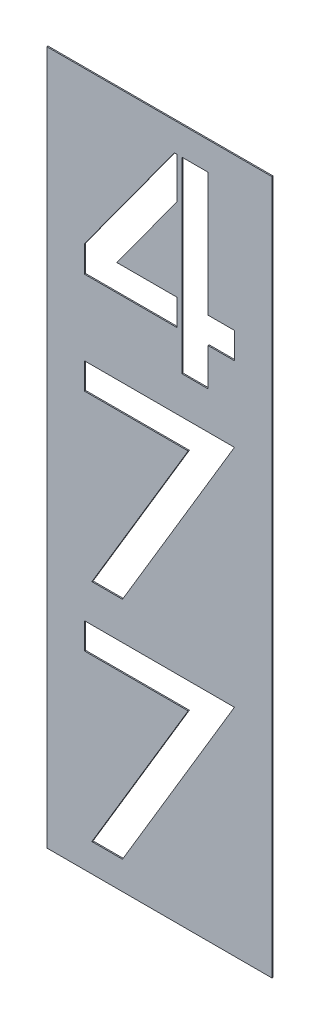
ISO-10303-21;
HEADER;
FILE_DESCRIPTION(('STEP AP214'),'2;1');
FILE_NAME('part.step','',(''),(''),'','','');
FILE_SCHEMA(('AUTOMOTIVE_DESIGN { 1 0 10303 214 1 1 1 1 }'));
ENDSEC;
DATA;
#1=APPLICATION_CONTEXT('core data for automotive mechanical design processes');
#2=APPLICATION_PROTOCOL_DEFINITION('international standard','automotive_design',2000,#1);
#3=PRODUCT_CONTEXT('',#1,'mechanical');
#4=PRODUCT('Part','Part','',(#3));
#5=PRODUCT_RELATED_PRODUCT_CATEGORY('part','',(#4));
#6=PRODUCT_DEFINITION_FORMATION('','',#4);
#7=PRODUCT_DEFINITION_CONTEXT('part definition',#1,'design');
#8=PRODUCT_DEFINITION('design','',#6,#7);
#9=PRODUCT_DEFINITION_SHAPE('','',#8);
#10=(LENGTH_UNIT() NAMED_UNIT(*) SI_UNIT(.MILLI.,.METRE.));
#11=(NAMED_UNIT(*) PLANE_ANGLE_UNIT() SI_UNIT($,.RADIAN.));
#12=(NAMED_UNIT(*) SI_UNIT($,.STERADIAN.) SOLID_ANGLE_UNIT());
#13=UNCERTAINTY_MEASURE_WITH_UNIT(LENGTH_MEASURE(1.E-05),#10,'distance_accuracy_value','');
#14=(GEOMETRIC_REPRESENTATION_CONTEXT(3) GLOBAL_UNCERTAINTY_ASSIGNED_CONTEXT((#13)) GLOBAL_UNIT_ASSIGNED_CONTEXT((#10,
#11,#12)) REPRESENTATION_CONTEXT('',''));
#15=CARTESIAN_POINT('',(0.,0.,0.));
#16=DIRECTION('',(0.,0.,1.));
#17=DIRECTION('',(1.,0.,0.));
#18=AXIS2_PLACEMENT_3D('',#15,#16,#17);
#19=CARTESIAN_POINT('',(6.03249999999999,25.4,-50.8247986346232));
#20=DIRECTION('',(-1.,0.,0.));
#21=DIRECTION('',(0.,0.,1.));
#22=AXIS2_PLACEMENT_3D('',#19,#20,#21);
#23=PLANE('',#22);
#24=DIRECTION('',(0.,-1.,0.));
#25=VECTOR('',#24,1.);
#26=CARTESIAN_POINT('',(6.03249999999999,25.4,0.4));
#27=LINE('',#26,#25);
#28=CARTESIAN_POINT('',(6.03249999999999,34.29,0.4));
#29=VERTEX_POINT('',#28);
#30=CARTESIAN_POINT('',(6.03249999999999,25.4,0.4));
#31=VERTEX_POINT('',#30);
#32=EDGE_CURVE('E90',#29,#31,#27,.T.);
#33=ORIENTED_EDGE('',*,*,#32,.F.);
#34=DIRECTION('',(0.,0.,-1.));
#35=VECTOR('',#34,1.);
#36=CARTESIAN_POINT('',(6.03249999999999,34.29,-50.8247986346232));
#37=LINE('',#36,#35);
#38=CARTESIAN_POINT('',(6.03249999999999,34.29,0.));
#39=VERTEX_POINT('',#38);
#40=EDGE_CURVE('E12',#29,#39,#37,.T.);
#41=ORIENTED_EDGE('',*,*,#40,.T.);
#42=DIRECTION('',(0.,1.,0.));
#43=VECTOR('',#42,1.);
#44=CARTESIAN_POINT('',(6.03249999999999,25.4,0.));
#45=LINE('',#44,#43);
#46=CARTESIAN_POINT('',(6.03249999999999,25.4,0.));
#47=VERTEX_POINT('',#46);
#48=EDGE_CURVE('E305',#47,#39,#45,.T.);
#49=ORIENTED_EDGE('',*,*,#48,.F.);
#50=DIRECTION('',(0.,0.,1.));
#51=VECTOR('',#50,1.);
#52=CARTESIAN_POINT('',(6.03249999999999,25.4,-50.8247986346232));
#53=LINE('',#52,#51);
#54=EDGE_CURVE('E314',#47,#31,#53,.T.);
#55=ORIENTED_EDGE('',*,*,#54,.T.);
#56=EDGE_LOOP('',(#33,#41,#49,#55));
#57=FACE_BOUND('',#56,.T.);
#58=ADVANCED_FACE('F66',(#57),#23,.T.);
#59=CARTESIAN_POINT('',(6.03249999999999,62.3950533971677,0.));
#60=VERTEX_POINT('',#59);
#61=CARTESIAN_POINT('',(6.03249999999999,76.2,0.));
#62=VERTEX_POINT('',#61);
#63=EDGE_CURVE('E310',#60,#62,#45,.T.);
#64=ORIENTED_EDGE('',*,*,#63,.F.);
#65=DIRECTION('',(0.,0.,1.));
#66=VECTOR('',#65,1.);
#67=CARTESIAN_POINT('',(6.03249999999999,62.3950533971678,-50.8247986346232));
#68=LINE('',#67,#66);
#69=CARTESIAN_POINT('',(6.03249999999999,62.3950533971677,0.399999999999999));
#70=VERTEX_POINT('',#69);
#71=EDGE_CURVE('E75',#60,#70,#68,.T.);
#72=ORIENTED_EDGE('',*,*,#71,.T.);
#73=CARTESIAN_POINT('',(6.03249999999999,76.2,0.4));
#74=VERTEX_POINT('',#73);
#75=EDGE_CURVE('E283',#74,#70,#27,.T.);
#76=ORIENTED_EDGE('',*,*,#75,.F.);
#77=DIRECTION('',(0.,0.,1.));
#78=VECTOR('',#77,1.);
#79=CARTESIAN_POINT('',(6.03249999999999,76.2,-50.8247986346232));
#80=LINE('',#79,#78);
#81=EDGE_CURVE('E318',#62,#74,#80,.T.);
#82=ORIENTED_EDGE('',*,*,#81,.F.);
#83=EDGE_LOOP('',(#64,#72,#76,#82));
#84=FACE_BOUND('',#83,.T.);
#85=ADVANCED_FACE('F601',(#84),#23,.T.);
#86=CARTESIAN_POINT('',(0.,76.2,0.4));
#87=DIRECTION('',(0.,1.,0.));
#88=DIRECTION('',(0.,0.,1.));
#89=AXIS2_PLACEMENT_3D('',#86,#87,#88);
#90=PLANE('',#89);
#91=DIRECTION('',(1.,0.,0.));
#92=VECTOR('',#91,1.);
#93=CARTESIAN_POINT('',(0.,76.2,0.4));
#94=LINE('',#93,#92);
#95=CARTESIAN_POINT('',(7.61999999999999,76.2,0.4));
#96=VERTEX_POINT('',#95);
#97=CARTESIAN_POINT('',(16.51,76.2,0.4));
#98=VERTEX_POINT('',#97);
#99=EDGE_CURVE('E361',#96,#98,#94,.T.);
#100=ORIENTED_EDGE('',*,*,#99,.F.);
#101=DIRECTION('',(0.,0.,1.));
#102=VECTOR('',#101,1.);
#103=CARTESIAN_POINT('',(7.61999999999999,76.2,-50.8247986346232));
#104=LINE('',#103,#102);
#105=CARTESIAN_POINT('',(7.61999999999999,76.2,0.));
#106=VERTEX_POINT('',#105);
#107=EDGE_CURVE('E313',#106,#96,#104,.T.);
#108=ORIENTED_EDGE('',*,*,#107,.F.);
#109=DIRECTION('',(1.,0.,0.));
#110=VECTOR('',#109,1.);
#111=CARTESIAN_POINT('',(0.,76.2,0.));
#112=LINE('',#111,#110);
#113=CARTESIAN_POINT('',(16.51,76.2,0.));
#114=VERTEX_POINT('',#113);
#115=EDGE_CURVE('E449',#106,#114,#112,.T.);
#116=ORIENTED_EDGE('',*,*,#115,.T.);
#117=DIRECTION('',(0.,0.,-1.));
#118=VECTOR('',#117,1.);
#119=CARTESIAN_POINT('',(16.51,76.2,0.4));
#120=LINE('',#119,#118);
#121=EDGE_CURVE('E557',#98,#114,#120,.T.);
#122=ORIENTED_EDGE('',*,*,#121,.F.);
#123=EDGE_LOOP('',(#100,#108,#116,#122));
#124=FACE_BOUND('',#123,.T.);
#125=ADVANCED_FACE('F613',(#124),#90,.F.);
#126=CARTESIAN_POINT('',(0.,-85.09,0.4));
#127=DIRECTION('',(0.,-1.,0.));
#128=DIRECTION('',(0.,0.,-1.));
#129=AXIS2_PLACEMENT_3D('',#126,#127,#128);
#130=PLANE('',#129);
#131=DIRECTION('',(-1.,0.,0.));
#132=VECTOR('',#131,1.);
#133=CARTESIAN_POINT('',(0.,-85.09,0.));
#134=LINE('',#133,#132);
#135=CARTESIAN_POINT('',(9.73957327900089,-85.09,0.));
#136=VERTEX_POINT('',#135);
#137=CARTESIAN_POINT('',(-25.4,-85.09,0.));
#138=VERTEX_POINT('',#137);
#139=EDGE_CURVE('E481',#136,#138,#134,.T.);
#140=ORIENTED_EDGE('',*,*,#139,.T.);
#141=DIRECTION('',(0.,0.,-1.));
#142=VECTOR('',#141,1.);
#143=CARTESIAN_POINT('',(-25.4,-85.09,0.4));
#144=LINE('',#143,#142);
#145=CARTESIAN_POINT('',(-25.4,-85.09,0.4));
#146=VERTEX_POINT('',#145);
#147=EDGE_CURVE('E520',#146,#138,#144,.T.);
#148=ORIENTED_EDGE('',*,*,#147,.F.);
#149=DIRECTION('',(-1.,0.,0.));
#150=VECTOR('',#149,1.);
#151=CARTESIAN_POINT('',(0.,-85.09,0.4));
#152=LINE('',#151,#150);
#153=CARTESIAN_POINT('',(9.73957327900089,-85.09,0.4));
#154=VERTEX_POINT('',#153);
#155=EDGE_CURVE('E392',#154,#146,#152,.T.);
#156=ORIENTED_EDGE('',*,*,#155,.F.);
#157=DIRECTION('',(0.,0.,-1.));
#158=VECTOR('',#157,1.);
#159=CARTESIAN_POINT('',(9.73957327900089,-85.09,0.4));
#160=LINE('',#159,#158);
#161=EDGE_CURVE('E499',#154,#136,#160,.T.);
#162=ORIENTED_EDGE('',*,*,#161,.T.);
#163=EDGE_LOOP('',(#140,#148,#156,#162));
#164=FACE_BOUND('',#163,.T.);
#165=ADVANCED_FACE('F688',(#164),#130,.F.);
#166=CARTESIAN_POINT('',(-25.4,0.,0.4));
#167=DIRECTION('',(-1.,0.,0.));
#168=DIRECTION('',(0.,-1.,0.));
#169=AXIS2_PLACEMENT_3D('',#166,#167,#168);
#170=PLANE('',#169);
#171=DIRECTION('',(0.,1.,0.));
#172=VECTOR('',#171,1.);
#173=CARTESIAN_POINT('',(-25.4,0.,0.));
#174=LINE('',#173,#172);
#175=CARTESIAN_POINT('',(-25.4,-76.2,0.));
#176=VERTEX_POINT('',#175);
#177=EDGE_CURVE('E485',#138,#176,#174,.T.);
#178=ORIENTED_EDGE('',*,*,#177,.T.);
#179=DIRECTION('',(0.,0.,-1.));
#180=VECTOR('',#179,1.);
#181=CARTESIAN_POINT('',(-25.4,-76.2,0.4));
#182=LINE('',#181,#180);
#183=CARTESIAN_POINT('',(-25.4,-76.2,0.4));
#184=VERTEX_POINT('',#183);
#185=EDGE_CURVE('E516',#184,#176,#182,.T.);
#186=ORIENTED_EDGE('',*,*,#185,.F.);
#187=DIRECTION('',(0.,1.,0.));
#188=VECTOR('',#187,1.);
#189=CARTESIAN_POINT('',(-25.4,0.,0.4));
#190=LINE('',#189,#188);
#191=EDGE_CURVE('E396',#146,#184,#190,.T.);
#192=ORIENTED_EDGE('',*,*,#191,.F.);
#193=ORIENTED_EDGE('',*,*,#147,.T.);
#194=EDGE_LOOP('',(#178,#186,#192,#193));
#195=FACE_BOUND('',#194,.T.);
#196=ADVANCED_FACE('F690',(#195),#170,.F.);
#197=CARTESIAN_POINT('',(0.,-76.2,0.4));
#198=DIRECTION('',(0.,1.,0.));
#199=DIRECTION('',(0.,0.,1.));
#200=AXIS2_PLACEMENT_3D('',#197,#198,#199);
#201=PLANE('',#200);
#202=DIRECTION('',(1.,0.,0.));
#203=VECTOR('',#202,1.);
#204=CARTESIAN_POINT('',(0.,-76.2,0.));
#205=LINE('',#204,#203);
#206=CARTESIAN_POINT('',(25.4,-76.2,0.));
#207=VERTEX_POINT('',#206);
#208=EDGE_CURVE('E488',#176,#207,#205,.T.);
#209=ORIENTED_EDGE('',*,*,#208,.T.);
#210=DIRECTION('',(0.,0.,-1.));
#211=VECTOR('',#210,1.);
#212=CARTESIAN_POINT('',(25.4,-76.2,0.4));
#213=LINE('',#212,#211);
#214=CARTESIAN_POINT('',(25.4,-76.2,0.4));
#215=VERTEX_POINT('',#214);
#216=EDGE_CURVE('E512',#215,#207,#213,.T.);
#217=ORIENTED_EDGE('',*,*,#216,.F.);
#218=DIRECTION('',(1.,0.,0.));
#219=VECTOR('',#218,1.);
#220=CARTESIAN_POINT('',(0.,-76.2,0.4));
#221=LINE('',#220,#219);
#222=EDGE_CURVE('E399',#184,#215,#221,.T.);
#223=ORIENTED_EDGE('',*,*,#222,.F.);
#224=ORIENTED_EDGE('',*,*,#185,.T.);
#225=EDGE_LOOP('',(#209,#217,#223,#224));
#226=FACE_BOUND('',#225,.T.);
#227=ADVANCED_FACE('F695',(#226),#201,.F.);
#228=CARTESIAN_POINT('',(52.2635457410299,-31.1988516609602,0.4));
#229=DIRECTION('',(0.858645221938647,-0.512570368673348,0.));
#230=DIRECTION('',(0.512570368673348,0.858645221938647,0.));
#231=AXIS2_PLACEMENT_3D('',#228,#229,#230);
#232=PLANE('',#231);
#233=DIRECTION('',(-0.512570368673348,-0.858645221938647,0.));
#234=VECTOR('',#233,1.);
#235=CARTESIAN_POINT('',(52.2635457410299,-31.1988516609602,0.));
#236=LINE('',#235,#234);
#237=CARTESIAN_POINT('',(-12.5064805569764,-139.700000000001,0.));
#238=VERTEX_POINT('',#237);
#239=EDGE_CURVE('E491',#207,#238,#236,.T.);
#240=ORIENTED_EDGE('',*,*,#239,.T.);
#241=DIRECTION('',(0.,0.,-1.));
#242=VECTOR('',#241,1.);
#243=CARTESIAN_POINT('',(-12.5064805569764,-139.700000000001,0.4));
#244=LINE('',#243,#242);
#245=CARTESIAN_POINT('',(-12.5064805569764,-139.700000000001,0.4));
#246=VERTEX_POINT('',#245);
#247=EDGE_CURVE('E508',#246,#238,#244,.T.);
#248=ORIENTED_EDGE('',*,*,#247,.F.);
#249=DIRECTION('',(-0.512570368673348,-0.858645221938647,0.));
#250=VECTOR('',#249,1.);
#251=CARTESIAN_POINT('',(52.2635457410299,-31.1988516609602,0.4));
#252=LINE('',#251,#250);
#253=EDGE_CURVE('E402',#215,#246,#252,.T.);
#254=ORIENTED_EDGE('',*,*,#253,.F.);
#255=ORIENTED_EDGE('',*,*,#216,.T.);
#256=EDGE_LOOP('',(#240,#248,#254,#255));
#257=FACE_BOUND('',#256,.T.);
#258=ADVANCED_FACE('F701',(#257),#232,.F.);
#259=CARTESIAN_POINT('',(0.,-139.700000000001,0.4));
#260=DIRECTION('',(0.,-1.,0.));
#261=DIRECTION('',(0.,0.,-1.));
#262=AXIS2_PLACEMENT_3D('',#259,#260,#261);
#263=PLANE('',#262);
#264=DIRECTION('',(-1.,0.,0.));
#265=VECTOR('',#264,1.);
#266=CARTESIAN_POINT('',(0.,-139.700000000001,0.));
#267=LINE('',#266,#265);
#268=CARTESIAN_POINT('',(-22.8599999999988,-139.700000000001,0.));
#269=VERTEX_POINT('',#268);
#270=EDGE_CURVE('E494',#238,#269,#267,.T.);
#271=ORIENTED_EDGE('',*,*,#270,.T.);
#272=DIRECTION('',(0.,0.,-1.));
#273=VECTOR('',#272,1.);
#274=CARTESIAN_POINT('',(-22.8599999999988,-139.700000000001,0.4));
#275=LINE('',#274,#273);
#276=CARTESIAN_POINT('',(-22.8599999999988,-139.700000000001,0.4));
#277=VERTEX_POINT('',#276);
#278=EDGE_CURVE('E503',#277,#269,#275,.T.);
#279=ORIENTED_EDGE('',*,*,#278,.F.);
#280=DIRECTION('',(-1.,0.,0.));
#281=VECTOR('',#280,1.);
#282=CARTESIAN_POINT('',(0.,-139.700000000001,0.4));
#283=LINE('',#282,#281);
#284=EDGE_CURVE('E405',#246,#277,#283,.T.);
#285=ORIENTED_EDGE('',*,*,#284,.F.);
#286=ORIENTED_EDGE('',*,*,#247,.T.);
#287=EDGE_LOOP('',(#271,#279,#285,#286));
#288=FACE_BOUND('',#287,.T.);
#289=ADVANCED_FACE('F705',(#288),#263,.F.);
#290=CARTESIAN_POINT('',(-32.9238918918919,23.9446486486486,0.4));
#291=DIRECTION('',(-0.808736084303189,0.588171697675046,0.));
#292=DIRECTION('',(-0.588171697675046,-0.808736084303189,0.));
#293=AXIS2_PLACEMENT_3D('',#290,#291,#292);
#294=PLANE('',#293);
#295=DIRECTION('',(0.588171697675046,0.808736084303189,0.));
#296=VECTOR('',#295,1.);
#297=CARTESIAN_POINT('',(-32.9238918918919,23.9446486486486,0.));
#298=LINE('',#297,#296);
#299=CARTESIAN_POINT('',(-25.4,34.29,0.));
#300=VERTEX_POINT('',#299);
#301=CARTESIAN_POINT('',(5.07999999999999,76.2,0.));
#302=VERTEX_POINT('',#301);
#303=EDGE_CURVE('E445',#300,#302,#298,.T.);
#304=ORIENTED_EDGE('',*,*,#303,.T.);
#305=DIRECTION('',(0.,0.,-1.));
#306=VECTOR('',#305,1.);
#307=CARTESIAN_POINT('',(5.07999999999999,76.2,0.4));
#308=LINE('',#307,#306);
#309=CARTESIAN_POINT('',(5.07999999999999,76.2,0.4));
#310=VERTEX_POINT('',#309);
#311=EDGE_CURVE('E504',#310,#302,#308,.T.);
#312=ORIENTED_EDGE('',*,*,#311,.F.);
#313=DIRECTION('',(0.588171697675046,0.808736084303189,0.));
#314=VECTOR('',#313,1.);
#315=CARTESIAN_POINT('',(-32.9238918918919,23.9446486486486,0.4));
#316=LINE('',#315,#314);
#317=CARTESIAN_POINT('',(-25.4,34.29,0.4));
#318=VERTEX_POINT('',#317);
#319=EDGE_CURVE('E357',#318,#310,#316,.T.);
#320=ORIENTED_EDGE('',*,*,#319,.F.);
#321=DIRECTION('',(0.,0.,-1.));
#322=VECTOR('',#321,1.);
#323=CARTESIAN_POINT('',(-25.4,34.29,0.4));
#324=LINE('',#323,#322);
#325=EDGE_CURVE('E524',#318,#300,#324,.T.);
#326=ORIENTED_EDGE('',*,*,#325,.T.);
#327=EDGE_LOOP('',(#304,#312,#320,#326));
#328=FACE_BOUND('',#327,.T.);
#329=ADVANCED_FACE('F767',(#328),#294,.F.);
#330=EDGE_CURVE('E450',#302,#62,#112,.T.);
#331=ORIENTED_EDGE('',*,*,#330,.T.);
#332=ORIENTED_EDGE('',*,*,#81,.T.);
#333=EDGE_CURVE('E362',#310,#74,#94,.T.);
#334=ORIENTED_EDGE('',*,*,#333,.F.);
#335=ORIENTED_EDGE('',*,*,#311,.T.);
#336=EDGE_LOOP('',(#331,#332,#334,#335));
#337=FACE_BOUND('',#336,.T.);
#338=ADVANCED_FACE('F762',(#337),#90,.F.);
#339=CARTESIAN_POINT('',(16.51,0.,0.4));
#340=DIRECTION('',(1.,0.,0.));
#341=DIRECTION('',(0.,1.,0.));
#342=AXIS2_PLACEMENT_3D('',#339,#340,#341);
#343=PLANE('',#342);
#344=DIRECTION('',(0.,-1.,0.));
#345=VECTOR('',#344,1.);
#346=CARTESIAN_POINT('',(16.51,0.,0.));
#347=LINE('',#346,#345);
#348=CARTESIAN_POINT('',(16.51,34.29,0.));
#349=VERTEX_POINT('',#348);
#350=EDGE_CURVE('E454',#114,#349,#347,.T.);
#351=ORIENTED_EDGE('',*,*,#350,.T.);
#352=DIRECTION('',(0.,0.,-1.));
#353=VECTOR('',#352,1.);
#354=CARTESIAN_POINT('',(16.51,34.29,0.4));
#355=LINE('',#354,#353);
#356=CARTESIAN_POINT('',(16.51,34.29,0.4));
#357=VERTEX_POINT('',#356);
#358=EDGE_CURVE('E553',#357,#349,#355,.T.);
#359=ORIENTED_EDGE('',*,*,#358,.F.);
#360=DIRECTION('',(0.,-1.,0.));
#361=VECTOR('',#360,1.);
#362=CARTESIAN_POINT('',(16.51,0.,0.4));
#363=LINE('',#362,#361);
#364=EDGE_CURVE('E365',#98,#357,#363,.T.);
#365=ORIENTED_EDGE('',*,*,#364,.F.);
#366=ORIENTED_EDGE('',*,*,#121,.T.);
#367=EDGE_LOOP('',(#351,#359,#365,#366));
#368=FACE_BOUND('',#367,.T.);
#369=ADVANCED_FACE('F617',(#368),#343,.F.);
#370=CARTESIAN_POINT('',(0.,34.29,0.4));
#371=DIRECTION('',(0.,1.,0.));
#372=DIRECTION('',(0.,0.,1.));
#373=AXIS2_PLACEMENT_3D('',#370,#371,#372);
#374=PLANE('',#373);
#375=DIRECTION('',(1.,0.,0.));
#376=VECTOR('',#375,1.);
#377=CARTESIAN_POINT('',(0.,34.29,0.));
#378=LINE('',#377,#376);
#379=CARTESIAN_POINT('',(25.4,34.29,0.));
#380=VERTEX_POINT('',#379);
#381=EDGE_CURVE('E457',#349,#380,#378,.T.);
#382=ORIENTED_EDGE('',*,*,#381,.T.);
#383=DIRECTION('',(0.,0.,-1.));
#384=VECTOR('',#383,1.);
#385=CARTESIAN_POINT('',(25.4,34.29,0.4));
#386=LINE('',#385,#384);
#387=CARTESIAN_POINT('',(25.4,34.29,0.4));
#388=VERTEX_POINT('',#387);
#389=EDGE_CURVE('E549',#388,#380,#386,.T.);
#390=ORIENTED_EDGE('',*,*,#389,.F.);
#391=DIRECTION('',(1.,0.,0.));
#392=VECTOR('',#391,1.);
#393=CARTESIAN_POINT('',(0.,34.29,0.4));
#394=LINE('',#393,#392);
#395=EDGE_CURVE('E368',#357,#388,#394,.T.);
#396=ORIENTED_EDGE('',*,*,#395,.F.);
#397=ORIENTED_EDGE('',*,*,#358,.T.);
#398=EDGE_LOOP('',(#382,#390,#396,#397));
#399=FACE_BOUND('',#398,.T.);
#400=ADVANCED_FACE('F622',(#399),#374,.F.);
#401=CARTESIAN_POINT('',(25.4,0.,0.4));
#402=DIRECTION('',(1.,0.,0.));
#403=DIRECTION('',(0.,0.,-1.));
#404=AXIS2_PLACEMENT_3D('',#401,#402,#403);
#405=PLANE('',#404);
#406=DIRECTION('',(0.,-1.,0.));
#407=VECTOR('',#406,1.);
#408=CARTESIAN_POINT('',(25.4,0.,0.));
#409=LINE('',#408,#407);
#410=CARTESIAN_POINT('',(25.4,25.4,0.));
#411=VERTEX_POINT('',#410);
#412=EDGE_CURVE('E460',#380,#411,#409,.T.);
#413=ORIENTED_EDGE('',*,*,#412,.T.);
#414=DIRECTION('',(0.,0.,-1.));
#415=VECTOR('',#414,1.);
#416=CARTESIAN_POINT('',(25.4,25.4,0.4));
#417=LINE('',#416,#415);
#418=CARTESIAN_POINT('',(25.4,25.4,0.4));
#419=VERTEX_POINT('',#418);
#420=EDGE_CURVE('E545',#419,#411,#417,.T.);
#421=ORIENTED_EDGE('',*,*,#420,.F.);
#422=DIRECTION('',(0.,-1.,0.));
#423=VECTOR('',#422,1.);
#424=CARTESIAN_POINT('',(25.4,0.,0.4));
#425=LINE('',#424,#423);
#426=EDGE_CURVE('E371',#388,#419,#425,.T.);
#427=ORIENTED_EDGE('',*,*,#426,.F.);
#428=ORIENTED_EDGE('',*,*,#389,.T.);
#429=EDGE_LOOP('',(#413,#421,#427,#428));
#430=FACE_BOUND('',#429,.T.);
#431=ADVANCED_FACE('F628',(#430),#405,.F.);
#432=CARTESIAN_POINT('',(0.,25.4,0.4));
#433=DIRECTION('',(0.,-1.,0.));
#434=DIRECTION('',(0.,0.,-1.));
#435=AXIS2_PLACEMENT_3D('',#432,#433,#434);
#436=PLANE('',#435);
#437=DIRECTION('',(-1.,0.,0.));
#438=VECTOR('',#437,1.);
#439=CARTESIAN_POINT('',(0.,25.4,0.));
#440=LINE('',#439,#438);
#441=CARTESIAN_POINT('',(16.51,25.4,0.));
#442=VERTEX_POINT('',#441);
#443=EDGE_CURVE('E463',#411,#442,#440,.T.);
#444=ORIENTED_EDGE('',*,*,#443,.T.);
#445=DIRECTION('',(0.,0.,-1.));
#446=VECTOR('',#445,1.);
#447=CARTESIAN_POINT('',(16.51,25.4,0.4));
#448=LINE('',#447,#446);
#449=CARTESIAN_POINT('',(16.51,25.4,0.4));
#450=VERTEX_POINT('',#449);
#451=EDGE_CURVE('E541',#450,#442,#448,.T.);
#452=ORIENTED_EDGE('',*,*,#451,.F.);
#453=DIRECTION('',(-1.,0.,0.));
#454=VECTOR('',#453,1.);
#455=CARTESIAN_POINT('',(0.,25.4,0.4));
#456=LINE('',#455,#454);
#457=EDGE_CURVE('E374',#419,#450,#456,.T.);
#458=ORIENTED_EDGE('',*,*,#457,.F.);
#459=ORIENTED_EDGE('',*,*,#420,.T.);
#460=EDGE_LOOP('',(#444,#452,#458,#459));
#461=FACE_BOUND('',#460,.T.);
#462=ADVANCED_FACE('F632',(#461),#436,.F.);
#463=CARTESIAN_POINT('',(16.51,0.,0.4));
#464=DIRECTION('',(1.,0.,0.));
#465=DIRECTION('',(0.,1.,0.));
#466=AXIS2_PLACEMENT_3D('',#463,#464,#465);
#467=PLANE('',#466);
#468=DIRECTION('',(0.,-1.,0.));
#469=VECTOR('',#468,1.);
#470=CARTESIAN_POINT('',(16.51,0.,0.));
#471=LINE('',#470,#469);
#472=CARTESIAN_POINT('',(16.51,12.7,0.));
#473=VERTEX_POINT('',#472);
#474=EDGE_CURVE('E466',#442,#473,#471,.T.);
#475=ORIENTED_EDGE('',*,*,#474,.T.);
#476=DIRECTION('',(0.,0.,-1.));
#477=VECTOR('',#476,1.);
#478=CARTESIAN_POINT('',(16.51,12.7,0.4));
#479=LINE('',#478,#477);
#480=CARTESIAN_POINT('',(16.51,12.7,0.4));
#481=VERTEX_POINT('',#480);
#482=EDGE_CURVE('E537',#481,#473,#479,.T.);
#483=ORIENTED_EDGE('',*,*,#482,.F.);
#484=DIRECTION('',(0.,-1.,0.));
#485=VECTOR('',#484,1.);
#486=CARTESIAN_POINT('',(16.51,0.,0.4));
#487=LINE('',#486,#485);
#488=EDGE_CURVE('E377',#450,#481,#487,.T.);
#489=ORIENTED_EDGE('',*,*,#488,.F.);
#490=ORIENTED_EDGE('',*,*,#451,.T.);
#491=EDGE_LOOP('',(#475,#483,#489,#490));
#492=FACE_BOUND('',#491,.T.);
#493=ADVANCED_FACE('F637',(#492),#467,.F.);
#494=CARTESIAN_POINT('',(0.,12.7,0.4));
#495=DIRECTION('',(0.,-1.,0.));
#496=DIRECTION('',(0.,0.,-1.));
#497=AXIS2_PLACEMENT_3D('',#494,#495,#496);
#498=PLANE('',#497);
#499=DIRECTION('',(-1.,0.,0.));
#500=VECTOR('',#499,1.);
#501=CARTESIAN_POINT('',(0.,12.7,0.));
#502=LINE('',#501,#500);
#503=CARTESIAN_POINT('',(7.61999999999999,12.7,0.));
#504=VERTEX_POINT('',#503);
#505=EDGE_CURVE('E469',#473,#504,#502,.T.);
#506=ORIENTED_EDGE('',*,*,#505,.T.);
#507=DIRECTION('',(0.,0.,-1.));
#508=VECTOR('',#507,1.);
#509=CARTESIAN_POINT('',(7.61999999999999,12.7,0.4));
#510=LINE('',#509,#508);
#511=CARTESIAN_POINT('',(7.61999999999999,12.7,0.4));
#512=VERTEX_POINT('',#511);
#513=EDGE_CURVE('E533',#512,#504,#510,.T.);
#514=ORIENTED_EDGE('',*,*,#513,.F.);
#515=DIRECTION('',(-1.,0.,0.));
#516=VECTOR('',#515,1.);
#517=CARTESIAN_POINT('',(0.,12.7,0.4));
#518=LINE('',#517,#516);
#519=EDGE_CURVE('E380',#481,#512,#518,.T.);
#520=ORIENTED_EDGE('',*,*,#519,.F.);
#521=ORIENTED_EDGE('',*,*,#482,.T.);
#522=EDGE_LOOP('',(#506,#514,#520,#521));
#523=FACE_BOUND('',#522,.T.);
#524=ADVANCED_FACE('F641',(#523),#498,.F.);
#525=CARTESIAN_POINT('',(7.61999999999999,0.,0.4));
#526=DIRECTION('',(-1.,0.,0.));
#527=DIRECTION('',(0.,0.,1.));
#528=AXIS2_PLACEMENT_3D('',#525,#526,#527);
#529=PLANE('',#528);
#530=ORIENTED_EDGE('',*,*,#107,.T.);
#531=DIRECTION('',(0.,1.,0.));
#532=VECTOR('',#531,1.);
#533=CARTESIAN_POINT('',(7.61999999999999,0.,0.4));
#534=LINE('',#533,#532);
#535=EDGE_CURVE('E383',#512,#96,#534,.T.);
#536=ORIENTED_EDGE('',*,*,#535,.F.);
#537=ORIENTED_EDGE('',*,*,#513,.T.);
#538=DIRECTION('',(0.,1.,0.));
#539=VECTOR('',#538,1.);
#540=CARTESIAN_POINT('',(7.61999999999999,0.,0.));
#541=LINE('',#540,#539);
#542=EDGE_CURVE('E472',#504,#106,#541,.T.);
#543=ORIENTED_EDGE('',*,*,#542,.T.);
#544=EDGE_LOOP('',(#530,#536,#537,#543));
#545=FACE_BOUND('',#544,.T.);
#546=ADVANCED_FACE('F645',(#545),#529,.F.);
#547=CARTESIAN_POINT('',(0.,25.4,0.4));
#548=DIRECTION('',(0.,-1.,0.));
#549=DIRECTION('',(1.,0.,0.));
#550=AXIS2_PLACEMENT_3D('',#547,#548,#549);
#551=PLANE('',#550);
#552=DIRECTION('',(-1.,0.,0.));
#553=VECTOR('',#552,1.);
#554=CARTESIAN_POINT('',(0.,25.4,0.4));
#555=LINE('',#554,#553);
#556=CARTESIAN_POINT('',(-25.4,25.4,0.4));
#557=VERTEX_POINT('',#556);
#558=EDGE_CURVE('E386',#31,#557,#555,.T.);
#559=ORIENTED_EDGE('',*,*,#558,.F.);
#560=ORIENTED_EDGE('',*,*,#54,.F.);
#561=DIRECTION('',(-1.,0.,0.));
#562=VECTOR('',#561,1.);
#563=CARTESIAN_POINT('',(0.,25.4,0.));
#564=LINE('',#563,#562);
#565=CARTESIAN_POINT('',(-25.4,25.4,0.));
#566=VERTEX_POINT('',#565);
#567=EDGE_CURVE('E475',#47,#566,#564,.T.);
#568=ORIENTED_EDGE('',*,*,#567,.T.);
#569=DIRECTION('',(0.,0.,-1.));
#570=VECTOR('',#569,1.);
#571=CARTESIAN_POINT('',(-25.4,25.4,0.4));
#572=LINE('',#571,#570);
#573=EDGE_CURVE('E528',#557,#566,#572,.T.);
#574=ORIENTED_EDGE('',*,*,#573,.F.);
#575=EDGE_LOOP('',(#559,#560,#568,#574));
#576=FACE_BOUND('',#575,.T.);
#577=ADVANCED_FACE('F740',(#576),#551,.F.);
#578=CARTESIAN_POINT('',(0.,-8.89,0.4));
#579=DIRECTION('',(0.,-1.,0.));
#580=DIRECTION('',(1.,0.,0.));
#581=AXIS2_PLACEMENT_3D('',#578,#579,#580);
#582=PLANE('',#581);
#583=DIRECTION('',(-1.,0.,0.));
#584=VECTOR('',#583,1.);
#585=CARTESIAN_POINT('',(0.,-8.89,0.));
#586=LINE('',#585,#584);
#587=CARTESIAN_POINT('',(9.73957327900069,-8.89,0.));
#588=VERTEX_POINT('',#587);
#589=CARTESIAN_POINT('',(-25.4,-8.89000000000001,0.));
#590=VERTEX_POINT('',#589);
#591=EDGE_CURVE('E426',#588,#590,#586,.T.);
#592=ORIENTED_EDGE('',*,*,#591,.T.);
#593=DIRECTION('',(0.,0.,-1.));
#594=VECTOR('',#593,1.);
#595=CARTESIAN_POINT('',(-25.4,-8.89000000000001,0.4));
#596=LINE('',#595,#594);
#597=CARTESIAN_POINT('',(-25.4,-8.89000000000001,0.4));
#598=VERTEX_POINT('',#597);
#599=EDGE_CURVE('E529',#598,#590,#596,.T.);
#600=ORIENTED_EDGE('',*,*,#599,.F.);
#601=DIRECTION('',(-1.,0.,0.));
#602=VECTOR('',#601,1.);
#603=CARTESIAN_POINT('',(0.,-8.89,0.4));
#604=LINE('',#603,#602);
#605=CARTESIAN_POINT('',(9.73957327900069,-8.89,0.4));
#606=VERTEX_POINT('',#605);
#607=EDGE_CURVE('E338',#606,#598,#604,.T.);
#608=ORIENTED_EDGE('',*,*,#607,.F.);
#609=DIRECTION('',(0.,0.,-1.));
#610=VECTOR('',#609,1.);
#611=CARTESIAN_POINT('',(9.73957327900069,-8.89,0.4));
#612=LINE('',#611,#610);
#613=EDGE_CURVE('E564',#606,#588,#612,.T.);
#614=ORIENTED_EDGE('',*,*,#613,.T.);
#615=EDGE_LOOP('',(#592,#600,#608,#614));
#616=FACE_BOUND('',#615,.T.);
#617=ADVANCED_FACE('F745',(#616),#582,.F.);
#618=CARTESIAN_POINT('',(-25.4,0.,0.4));
#619=DIRECTION('',(-1.,0.,0.));
#620=DIRECTION('',(0.,0.,1.));
#621=AXIS2_PLACEMENT_3D('',#618,#619,#620);
#622=PLANE('',#621);
#623=DIRECTION('',(0.,1.,0.));
#624=VECTOR('',#623,1.);
#625=CARTESIAN_POINT('',(-25.4,0.,0.));
#626=LINE('',#625,#624);
#627=CARTESIAN_POINT('',(-25.4,0.,0.));
#628=VERTEX_POINT('',#627);
#629=EDGE_CURVE('E430',#590,#628,#626,.T.);
#630=ORIENTED_EDGE('',*,*,#629,.T.);
#631=DIRECTION('',(0.,0.,-1.));
#632=VECTOR('',#631,1.);
#633=CARTESIAN_POINT('',(-25.4,0.,0.4));
#634=LINE('',#633,#632);
#635=CARTESIAN_POINT('',(-25.4,0.,0.4));
#636=VERTEX_POINT('',#635);
#637=EDGE_CURVE('E580',#636,#628,#634,.T.);
#638=ORIENTED_EDGE('',*,*,#637,.F.);
#639=DIRECTION('',(0.,1.,0.));
#640=VECTOR('',#639,1.);
#641=CARTESIAN_POINT('',(-25.4,0.,0.4));
#642=LINE('',#641,#640);
#643=EDGE_CURVE('E342',#598,#636,#642,.T.);
#644=ORIENTED_EDGE('',*,*,#643,.F.);
#645=ORIENTED_EDGE('',*,*,#599,.T.);
#646=EDGE_LOOP('',(#630,#638,#644,#645));
#647=FACE_BOUND('',#646,.T.);
#648=ADVANCED_FACE('F873',(#647),#622,.F.);
#649=CARTESIAN_POINT('',(0.,0.,0.4));
#650=DIRECTION('',(0.,1.,0.));
#651=DIRECTION('',(-1.,0.,0.));
#652=AXIS2_PLACEMENT_3D('',#649,#650,#651);
#653=PLANE('',#652);
#654=DIRECTION('',(1.,0.,0.));
#655=VECTOR('',#654,1.);
#656=CARTESIAN_POINT('',(0.,0.,0.));
#657=LINE('',#656,#655);
#658=CARTESIAN_POINT('',(25.4,0.,0.));
#659=VERTEX_POINT('',#658);
#660=EDGE_CURVE('E433',#628,#659,#657,.T.);
#661=ORIENTED_EDGE('',*,*,#660,.T.);
#662=DIRECTION('',(0.,0.,-1.));
#663=VECTOR('',#662,1.);
#664=CARTESIAN_POINT('',(25.4,0.,0.4));
#665=LINE('',#664,#663);
#666=CARTESIAN_POINT('',(25.4,0.,0.4));
#667=VERTEX_POINT('',#666);
#668=EDGE_CURVE('E576',#667,#659,#665,.T.);
#669=ORIENTED_EDGE('',*,*,#668,.F.);
#670=DIRECTION('',(1.,0.,0.));
#671=VECTOR('',#670,1.);
#672=CARTESIAN_POINT('',(0.,0.,0.4));
#673=LINE('',#672,#671);
#674=EDGE_CURVE('E345',#636,#667,#673,.T.);
#675=ORIENTED_EDGE('',*,*,#674,.F.);
#676=ORIENTED_EDGE('',*,*,#637,.T.);
#677=EDGE_LOOP('',(#661,#669,#675,#676));
#678=FACE_BOUND('',#677,.T.);
#679=ADVANCED_FACE('F863',(#678),#653,.F.);
#680=CARTESIAN_POINT('',(18.7266990758145,-11.1789488884052,0.4));
#681=DIRECTION('',(0.858645221938637,-0.512570368673364,0.));
#682=DIRECTION('',(0.512570368673364,0.858645221938637,0.));
#683=AXIS2_PLACEMENT_3D('',#680,#681,#682);
#684=PLANE('',#683);
#685=DIRECTION('',(-0.512570368673364,-0.858645221938637,0.));
#686=VECTOR('',#685,1.);
#687=CARTESIAN_POINT('',(18.7266990758145,-11.1789488884052,0.));
#688=LINE('',#687,#686);
#689=CARTESIAN_POINT('',(-12.5064805569775,-63.5,0.));
#690=VERTEX_POINT('',#689);
#691=EDGE_CURVE('E436',#659,#690,#688,.T.);
#692=ORIENTED_EDGE('',*,*,#691,.T.);
#693=DIRECTION('',(0.,0.,-1.));
#694=VECTOR('',#693,1.);
#695=CARTESIAN_POINT('',(-12.5064805569775,-63.5,0.4));
#696=LINE('',#695,#694);
#697=CARTESIAN_POINT('',(-12.5064805569775,-63.5,0.4));
#698=VERTEX_POINT('',#697);
#699=EDGE_CURVE('E573',#698,#690,#696,.T.);
#700=ORIENTED_EDGE('',*,*,#699,.F.);
#701=DIRECTION('',(-0.512570368673364,-0.858645221938637,0.));
#702=VECTOR('',#701,1.);
#703=CARTESIAN_POINT('',(18.7266990758145,-11.1789488884052,0.4));
#704=LINE('',#703,#702);
#705=EDGE_CURVE('E348',#667,#698,#704,.T.);
#706=ORIENTED_EDGE('',*,*,#705,.F.);
#707=ORIENTED_EDGE('',*,*,#668,.T.);
#708=EDGE_LOOP('',(#692,#700,#706,#707));
#709=FACE_BOUND('',#708,.T.);
#710=ADVANCED_FACE('F853',(#709),#684,.F.);
#711=CARTESIAN_POINT('',(0.,-63.5,0.4));
#712=DIRECTION('',(0.,-1.,0.));
#713=DIRECTION('',(0.,0.,-1.));
#714=AXIS2_PLACEMENT_3D('',#711,#712,#713);
#715=PLANE('',#714);
#716=DIRECTION('',(-1.,0.,0.));
#717=VECTOR('',#716,1.);
#718=CARTESIAN_POINT('',(0.,-63.5,0.));
#719=LINE('',#718,#717);
#720=CARTESIAN_POINT('',(-22.86,-63.5,0.));
#721=VERTEX_POINT('',#720);
#722=EDGE_CURVE('E439',#690,#721,#719,.T.);
#723=ORIENTED_EDGE('',*,*,#722,.T.);
#724=DIRECTION('',(0.,0.,-1.));
#725=VECTOR('',#724,1.);
#726=CARTESIAN_POINT('',(-22.86,-63.5,0.4));
#727=LINE('',#726,#725);
#728=CARTESIAN_POINT('',(-22.86,-63.5,0.4));
#729=VERTEX_POINT('',#728);
#730=EDGE_CURVE('E568',#729,#721,#727,.T.);
#731=ORIENTED_EDGE('',*,*,#730,.F.);
#732=DIRECTION('',(-1.,0.,0.));
#733=VECTOR('',#732,1.);
#734=CARTESIAN_POINT('',(0.,-63.5,0.4));
#735=LINE('',#734,#733);
#736=EDGE_CURVE('E351',#698,#729,#735,.T.);
#737=ORIENTED_EDGE('',*,*,#736,.F.);
#738=ORIENTED_EDGE('',*,*,#699,.T.);
#739=EDGE_LOOP('',(#723,#731,#737,#738));
#740=FACE_BOUND('',#739,.T.);
#741=ADVANCED_FACE('F845',(#740),#715,.F.);
#742=CARTESIAN_POINT('',(38.1000000000001,0.,0.4));
#743=DIRECTION('',(1.,0.,0.));
#744=DIRECTION('',(0.,1.,0.));
#745=AXIS2_PLACEMENT_3D('',#742,#743,#744);
#746=PLANE('',#745);
#747=DIRECTION('',(0.,-1.,0.));
#748=VECTOR('',#747,1.);
#749=CARTESIAN_POINT('',(38.1000000000001,0.,0.));
#750=LINE('',#749,#748);
#751=CARTESIAN_POINT('',(38.1000000000001,85.7249999999999,0.));
#752=VERTEX_POINT('',#751);
#753=CARTESIAN_POINT('',(38.1000000000001,-149.225,0.));
#754=VERTEX_POINT('',#753);
#755=EDGE_CURVE('E309',#752,#754,#750,.T.);
#756=ORIENTED_EDGE('',*,*,#755,.F.);
#757=DIRECTION('',(0.,0.,-1.));
#758=VECTOR('',#757,1.);
#759=CARTESIAN_POINT('',(38.1000000000001,85.7249999999999,0.4));
#760=LINE('',#759,#758);
#761=CARTESIAN_POINT('',(38.1000000000001,85.7249999999999,0.4));
#762=VERTEX_POINT('',#761);
#763=EDGE_CURVE('E569',#762,#752,#760,.T.);
#764=ORIENTED_EDGE('',*,*,#763,.F.);
#765=DIRECTION('',(0.,-1.,0.));
#766=VECTOR('',#765,1.);
#767=CARTESIAN_POINT('',(38.1000000000001,0.,0.4));
#768=LINE('',#767,#766);
#769=CARTESIAN_POINT('',(38.1000000000001,-149.225,0.4));
#770=VERTEX_POINT('',#769);
#771=EDGE_CURVE('E323',#762,#770,#768,.T.);
#772=ORIENTED_EDGE('',*,*,#771,.T.);
#773=DIRECTION('',(0.,0.,-1.));
#774=VECTOR('',#773,1.);
#775=CARTESIAN_POINT('',(38.1000000000001,-149.225,0.4));
#776=LINE('',#775,#774);
#777=EDGE_CURVE('E411',#770,#754,#776,.T.);
#778=ORIENTED_EDGE('',*,*,#777,.T.);
#779=EDGE_LOOP('',(#756,#764,#772,#778));
#780=FACE_BOUND('',#779,.T.);
#781=ADVANCED_FACE('F68',(#780),#746,.T.);
#782=CARTESIAN_POINT('',(0.,85.7249999999999,0.4));
#783=DIRECTION('',(0.,1.,0.));
#784=DIRECTION('',(0.,0.,1.));
#785=AXIS2_PLACEMENT_3D('',#782,#783,#784);
#786=PLANE('',#785);
#787=DIRECTION('',(1.,0.,0.));
#788=VECTOR('',#787,1.);
#789=CARTESIAN_POINT('',(0.,85.7249999999999,0.));
#790=LINE('',#789,#788);
#791=CARTESIAN_POINT('',(-38.0999999999999,85.7249999999999,0.));
#792=VERTEX_POINT('',#791);
#793=EDGE_CURVE('E415',#792,#752,#790,.T.);
#794=ORIENTED_EDGE('',*,*,#793,.F.);
#795=DIRECTION('',(0.,0.,-1.));
#796=VECTOR('',#795,1.);
#797=CARTESIAN_POINT('',(-38.0999999999999,85.7249999999999,0.4));
#798=LINE('',#797,#796);
#799=CARTESIAN_POINT('',(-38.0999999999999,85.7249999999999,0.4));
#800=VERTEX_POINT('',#799);
#801=EDGE_CURVE('E593',#800,#792,#798,.T.);
#802=ORIENTED_EDGE('',*,*,#801,.F.);
#803=DIRECTION('',(1.,0.,0.));
#804=VECTOR('',#803,1.);
#805=CARTESIAN_POINT('',(0.,85.7249999999999,0.4));
#806=LINE('',#805,#804);
#807=EDGE_CURVE('E327',#800,#762,#806,.T.);
#808=ORIENTED_EDGE('',*,*,#807,.T.);
#809=ORIENTED_EDGE('',*,*,#763,.T.);
#810=EDGE_LOOP('',(#794,#802,#808,#809));
#811=FACE_BOUND('',#810,.T.);
#812=ADVANCED_FACE('F674',(#811),#786,.T.);
#813=CARTESIAN_POINT('',(-38.0999999999999,0.,0.4));
#814=DIRECTION('',(1.,0.,0.));
#815=DIRECTION('',(0.,1.,0.));
#816=AXIS2_PLACEMENT_3D('',#813,#814,#815);
#817=PLANE('',#816);
#818=DIRECTION('',(0.,-1.,0.));
#819=VECTOR('',#818,1.);
#820=CARTESIAN_POINT('',(-38.0999999999999,0.,0.));
#821=LINE('',#820,#819);
#822=CARTESIAN_POINT('',(-38.0999999999999,-149.225,0.));
#823=VERTEX_POINT('',#822);
#824=EDGE_CURVE('E419',#792,#823,#821,.T.);
#825=ORIENTED_EDGE('',*,*,#824,.T.);
#826=DIRECTION('',(0.,0.,-1.));
#827=VECTOR('',#826,1.);
#828=CARTESIAN_POINT('',(-38.0999999999999,-149.225,0.4));
#829=LINE('',#828,#827);
#830=CARTESIAN_POINT('',(-38.0999999999999,-149.225,0.4));
#831=VERTEX_POINT('',#830);
#832=EDGE_CURVE('E589',#831,#823,#829,.T.);
#833=ORIENTED_EDGE('',*,*,#832,.F.);
#834=DIRECTION('',(0.,-1.,0.));
#835=VECTOR('',#834,1.);
#836=CARTESIAN_POINT('',(-38.0999999999999,0.,0.4));
#837=LINE('',#836,#835);
#838=EDGE_CURVE('E332',#800,#831,#837,.T.);
#839=ORIENTED_EDGE('',*,*,#838,.F.);
#840=ORIENTED_EDGE('',*,*,#801,.T.);
#841=EDGE_LOOP('',(#825,#833,#839,#840));
#842=FACE_BOUND('',#841,.T.);
#843=ADVANCED_FACE('F671',(#842),#817,.F.);
#844=CARTESIAN_POINT('',(-25.4,0.,0.4));
#845=DIRECTION('',(-1.,0.,0.));
#846=DIRECTION('',(0.,0.,1.));
#847=AXIS2_PLACEMENT_3D('',#844,#845,#846);
#848=PLANE('',#847);
#849=DIRECTION('',(0.,1.,0.));
#850=VECTOR('',#849,1.);
#851=CARTESIAN_POINT('',(-25.4,0.,0.));
#852=LINE('',#851,#850);
#853=EDGE_CURVE('E478',#566,#300,#852,.T.);
#854=ORIENTED_EDGE('',*,*,#853,.T.);
#855=ORIENTED_EDGE('',*,*,#325,.F.);
#856=DIRECTION('',(0.,1.,0.));
#857=VECTOR('',#856,1.);
#858=CARTESIAN_POINT('',(-25.4,0.,0.4));
#859=LINE('',#858,#857);
#860=EDGE_CURVE('E389',#557,#318,#859,.T.);
#861=ORIENTED_EDGE('',*,*,#860,.F.);
#862=ORIENTED_EDGE('',*,*,#573,.T.);
#863=EDGE_LOOP('',(#854,#855,#861,#862));
#864=FACE_BOUND('',#863,.T.);
#865=ADVANCED_FACE('F811',(#864),#848,.F.);
#866=CARTESIAN_POINT('',(11.09334305278,-6.62219831089902,0.4));
#867=DIRECTION('',(-0.858645221938637,0.512570368673364,0.));
#868=DIRECTION('',(-0.512570368673364,-0.858645221938637,0.));
#869=AXIS2_PLACEMENT_3D('',#866,#867,#868);
#870=PLANE('',#869);
#871=DIRECTION('',(0.512570368673364,0.858645221938637,0.));
#872=VECTOR('',#871,1.);
#873=CARTESIAN_POINT('',(11.09334305278,-6.62219831089902,0.));
#874=LINE('',#873,#872);
#875=EDGE_CURVE('E442',#721,#588,#874,.T.);
#876=ORIENTED_EDGE('',*,*,#875,.T.);
#877=ORIENTED_EDGE('',*,*,#613,.F.);
#878=DIRECTION('',(0.512570368673364,0.858645221938637,0.));
#879=VECTOR('',#878,1.);
#880=CARTESIAN_POINT('',(11.09334305278,-6.62219831089902,0.4));
#881=LINE('',#880,#879);
#882=EDGE_CURVE('E354',#729,#606,#881,.T.);
#883=ORIENTED_EDGE('',*,*,#882,.F.);
#884=ORIENTED_EDGE('',*,*,#730,.T.);
#885=EDGE_LOOP('',(#876,#877,#883,#884));
#886=FACE_BOUND('',#885,.T.);
#887=ADVANCED_FACE('F711',(#886),#870,.F.);
#888=CARTESIAN_POINT('',(0.,-149.225,0.4));
#889=DIRECTION('',(0.,1.,0.));
#890=DIRECTION('',(0.,0.,1.));
#891=AXIS2_PLACEMENT_3D('',#888,#889,#890);
#892=PLANE('',#891);
#893=DIRECTION('',(1.,0.,0.));
#894=VECTOR('',#893,1.);
#895=CARTESIAN_POINT('',(0.,-149.225,0.));
#896=LINE('',#895,#894);
#897=EDGE_CURVE('E422',#823,#754,#896,.T.);
#898=ORIENTED_EDGE('',*,*,#897,.T.);
#899=ORIENTED_EDGE('',*,*,#777,.F.);
#900=DIRECTION('',(1.,0.,0.));
#901=VECTOR('',#900,1.);
#902=CARTESIAN_POINT('',(0.,-149.225,0.4));
#903=LINE('',#902,#901);
#904=EDGE_CURVE('E335',#831,#770,#903,.T.);
#905=ORIENTED_EDGE('',*,*,#904,.F.);
#906=ORIENTED_EDGE('',*,*,#832,.T.);
#907=EDGE_LOOP('',(#898,#899,#905,#906));
#908=FACE_BOUND('',#907,.T.);
#909=ADVANCED_FACE('F667',(#908),#892,.F.);
#910=CARTESIAN_POINT('',(44.6301897179952,-26.642101083454,0.4));
#911=DIRECTION('',(-0.858645221938647,0.512570368673347,0.));
#912=DIRECTION('',(-0.512570368673347,-0.858645221938647,0.));
#913=AXIS2_PLACEMENT_3D('',#910,#911,#912);
#914=PLANE('',#913);
#915=DIRECTION('',(0.512570368673347,0.858645221938647,0.));
#916=VECTOR('',#915,1.);
#917=CARTESIAN_POINT('',(44.6301897179952,-26.642101083454,0.));
#918=LINE('',#917,#916);
#919=EDGE_CURVE('E328',#269,#136,#918,.T.);
#920=ORIENTED_EDGE('',*,*,#919,.T.);
#921=ORIENTED_EDGE('',*,*,#161,.F.);
#922=DIRECTION('',(0.512570368673347,0.858645221938647,0.));
#923=VECTOR('',#922,1.);
#924=CARTESIAN_POINT('',(44.6301897179952,-26.642101083454,0.4));
#925=LINE('',#924,#923);
#926=EDGE_CURVE('E408',#277,#154,#925,.T.);
#927=ORIENTED_EDGE('',*,*,#926,.F.);
#928=ORIENTED_EDGE('',*,*,#278,.T.);
#929=EDGE_LOOP('',(#920,#921,#927,#928));
#930=FACE_BOUND('',#929,.T.);
#931=ADVANCED_FACE('F677',(#930),#914,.F.);
#932=CARTESIAN_POINT('',(0.,0.,0.4));
#933=DIRECTION('',(0.,0.,1.));
#934=DIRECTION('',(1.,0.,0.));
#935=AXIS2_PLACEMENT_3D('',#932,#933,#934);
#936=PLANE('',#935);
#937=DIRECTION('',(1.,0.,0.));
#938=VECTOR('',#937,1.);
#939=CARTESIAN_POINT('',(0.,34.29,0.4));
#940=LINE('',#939,#938);
#941=CARTESIAN_POINT('',(-14.4075388343038,34.29,0.4));
#942=VERTEX_POINT('',#941);
#943=EDGE_CURVE('E280',#942,#29,#940,.T.);
#944=ORIENTED_EDGE('',*,*,#943,.T.);
#945=ORIENTED_EDGE('',*,*,#32,.T.);
#946=ORIENTED_EDGE('',*,*,#558,.T.);
#947=ORIENTED_EDGE('',*,*,#860,.T.);
#948=ORIENTED_EDGE('',*,*,#319,.T.);
#949=ORIENTED_EDGE('',*,*,#333,.T.);
#950=ORIENTED_EDGE('',*,*,#75,.T.);
#951=DIRECTION('',(-0.588171697675046,-0.808736084303189,0.));
#952=VECTOR('',#951,1.);
#953=CARTESIAN_POINT('',(-25.7342281024365,18.7158022563175,0.4));
#954=LINE('',#953,#952);
#955=EDGE_CURVE('E275',#70,#942,#954,.T.);
#956=ORIENTED_EDGE('',*,*,#955,.T.);
#957=EDGE_LOOP('',(#944,#945,#946,#947,#948,#949,#950,#956));
#958=FACE_BOUND('',#957,.T.);
#959=ORIENTED_EDGE('',*,*,#535,.T.);
#960=ORIENTED_EDGE('',*,*,#99,.T.);
#961=ORIENTED_EDGE('',*,*,#364,.T.);
#962=ORIENTED_EDGE('',*,*,#395,.T.);
#963=ORIENTED_EDGE('',*,*,#426,.T.);
#964=ORIENTED_EDGE('',*,*,#457,.T.);
#965=ORIENTED_EDGE('',*,*,#488,.T.);
#966=ORIENTED_EDGE('',*,*,#519,.T.);
#967=EDGE_LOOP('',(#959,#960,#961,#962,#963,#964,#965,#966));
#968=FACE_BOUND('',#967,.T.);
#969=ORIENTED_EDGE('',*,*,#771,.F.);
#970=ORIENTED_EDGE('',*,*,#807,.F.);
#971=ORIENTED_EDGE('',*,*,#838,.T.);
#972=ORIENTED_EDGE('',*,*,#904,.T.);
#973=EDGE_LOOP('',(#969,#970,#971,#972));
#974=FACE_BOUND('',#973,.T.);
#975=ORIENTED_EDGE('',*,*,#607,.T.);
#976=ORIENTED_EDGE('',*,*,#643,.T.);
#977=ORIENTED_EDGE('',*,*,#674,.T.);
#978=ORIENTED_EDGE('',*,*,#705,.T.);
#979=ORIENTED_EDGE('',*,*,#736,.T.);
#980=ORIENTED_EDGE('',*,*,#882,.T.);
#981=EDGE_LOOP('',(#975,#976,#977,#978,#979,#980));
#982=FACE_BOUND('',#981,.T.);
#983=ORIENTED_EDGE('',*,*,#155,.T.);
#984=ORIENTED_EDGE('',*,*,#191,.T.);
#985=ORIENTED_EDGE('',*,*,#222,.T.);
#986=ORIENTED_EDGE('',*,*,#253,.T.);
#987=ORIENTED_EDGE('',*,*,#284,.T.);
#988=ORIENTED_EDGE('',*,*,#926,.T.);
#989=EDGE_LOOP('',(#983,#984,#985,#986,#987,#988));
#990=FACE_BOUND('',#989,.T.);
#991=ADVANCED_FACE('F277',(#958,#968,#974,#982,#990),#936,.T.);
#992=CARTESIAN_POINT('',(0.,0.,0.));
#993=DIRECTION('',(0.,0.,1.));
#994=DIRECTION('',(1.,0.,0.));
#995=AXIS2_PLACEMENT_3D('',#992,#993,#994);
#996=PLANE('',#995);
#997=ORIENTED_EDGE('',*,*,#48,.T.);
#998=DIRECTION('',(1.,0.,0.));
#999=VECTOR('',#998,1.);
#1000=CARTESIAN_POINT('',(0.,34.29,0.));
#1001=LINE('',#1000,#999);
#1002=CARTESIAN_POINT('',(-14.4075388343038,34.29,0.));
#1003=VERTEX_POINT('',#1002);
#1004=EDGE_CURVE('E300',#1003,#39,#1001,.T.);
#1005=ORIENTED_EDGE('',*,*,#1004,.F.);
#1006=DIRECTION('',(-0.588171697675046,-0.808736084303189,0.));
#1007=VECTOR('',#1006,1.);
#1008=CARTESIAN_POINT('',(-25.7342281024365,18.7158022563175,0.));
#1009=LINE('',#1008,#1007);
#1010=EDGE_CURVE('E82',#60,#1003,#1009,.T.);
#1011=ORIENTED_EDGE('',*,*,#1010,.F.);
#1012=ORIENTED_EDGE('',*,*,#63,.T.);
#1013=ORIENTED_EDGE('',*,*,#330,.F.);
#1014=ORIENTED_EDGE('',*,*,#303,.F.);
#1015=ORIENTED_EDGE('',*,*,#853,.F.);
#1016=ORIENTED_EDGE('',*,*,#567,.F.);
#1017=EDGE_LOOP('',(#997,#1005,#1011,#1012,#1013,#1014,#1015,#1016));
#1018=FACE_BOUND('',#1017,.T.);
#1019=ORIENTED_EDGE('',*,*,#115,.F.);
#1020=ORIENTED_EDGE('',*,*,#542,.F.);
#1021=ORIENTED_EDGE('',*,*,#505,.F.);
#1022=ORIENTED_EDGE('',*,*,#474,.F.);
#1023=ORIENTED_EDGE('',*,*,#443,.F.);
#1024=ORIENTED_EDGE('',*,*,#412,.F.);
#1025=ORIENTED_EDGE('',*,*,#381,.F.);
#1026=ORIENTED_EDGE('',*,*,#350,.F.);
#1027=EDGE_LOOP('',(#1019,#1020,#1021,#1022,#1023,#1024,#1025,#1026));
#1028=FACE_BOUND('',#1027,.T.);
#1029=ORIENTED_EDGE('',*,*,#139,.F.);
#1030=ORIENTED_EDGE('',*,*,#919,.F.);
#1031=ORIENTED_EDGE('',*,*,#270,.F.);
#1032=ORIENTED_EDGE('',*,*,#239,.F.);
#1033=ORIENTED_EDGE('',*,*,#208,.F.);
#1034=ORIENTED_EDGE('',*,*,#177,.F.);
#1035=EDGE_LOOP('',(#1029,#1030,#1031,#1032,#1033,#1034));
#1036=FACE_BOUND('',#1035,.T.);
#1037=ORIENTED_EDGE('',*,*,#591,.F.);
#1038=ORIENTED_EDGE('',*,*,#875,.F.);
#1039=ORIENTED_EDGE('',*,*,#722,.F.);
#1040=ORIENTED_EDGE('',*,*,#691,.F.);
#1041=ORIENTED_EDGE('',*,*,#660,.F.);
#1042=ORIENTED_EDGE('',*,*,#629,.F.);
#1043=EDGE_LOOP('',(#1037,#1038,#1039,#1040,#1041,#1042));
#1044=FACE_BOUND('',#1043,.T.);
#1045=ORIENTED_EDGE('',*,*,#755,.T.);
#1046=ORIENTED_EDGE('',*,*,#897,.F.);
#1047=ORIENTED_EDGE('',*,*,#824,.F.);
#1048=ORIENTED_EDGE('',*,*,#793,.T.);
#1049=EDGE_LOOP('',(#1045,#1046,#1047,#1048));
#1050=FACE_BOUND('',#1049,.T.);
#1051=ADVANCED_FACE('F647',(#1018,#1028,#1036,#1044,#1050),#996,.F.);
#1052=CARTESIAN_POINT('',(0.,34.29,0.4));
#1053=DIRECTION('',(0.,1.,0.));
#1054=DIRECTION('',(0.,0.,1.));
#1055=AXIS2_PLACEMENT_3D('',#1052,#1053,#1054);
#1056=PLANE('',#1055);
#1057=ORIENTED_EDGE('',*,*,#40,.F.);
#1058=ORIENTED_EDGE('',*,*,#943,.F.);
#1059=DIRECTION('',(0.,0.,-1.));
#1060=VECTOR('',#1059,1.);
#1061=CARTESIAN_POINT('',(-14.4075388343038,34.29,0.4));
#1062=LINE('',#1061,#1060);
#1063=EDGE_CURVE('E287',#942,#1003,#1062,.T.);
#1064=ORIENTED_EDGE('',*,*,#1063,.T.);
#1065=ORIENTED_EDGE('',*,*,#1004,.T.);
#1066=EDGE_LOOP('',(#1057,#1058,#1064,#1065));
#1067=FACE_BOUND('',#1066,.T.);
#1068=ADVANCED_FACE('F294',(#1067),#1056,.F.);
#1069=CARTESIAN_POINT('',(-25.7342281024365,18.7158022563175,0.4));
#1070=DIRECTION('',(0.808736084303189,-0.588171697675046,0.));
#1071=DIRECTION('',(0.588171697675046,0.808736084303189,0.));
#1072=AXIS2_PLACEMENT_3D('',#1069,#1070,#1071);
#1073=PLANE('',#1072);
#1074=ORIENTED_EDGE('',*,*,#71,.F.);
#1075=ORIENTED_EDGE('',*,*,#1010,.T.);
#1076=ORIENTED_EDGE('',*,*,#1063,.F.);
#1077=ORIENTED_EDGE('',*,*,#955,.F.);
#1078=EDGE_LOOP('',(#1074,#1075,#1076,#1077));
#1079=FACE_BOUND('',#1078,.T.);
#1080=ADVANCED_FACE('F290',(#1079),#1073,.F.);
#1081=CLOSED_SHELL('',(#58,#85,#125,#165,#196,#227,#258,#289,#329,#338,#369,#400,#431,#462,#493,
#524,#546,#577,#617,#648,#679,#710,#741,#781,#812,#843,#865,#887,#909,#931,#991,#1051,#1068,#1080));
#1082=MANIFOLD_SOLID_BREP('B2',#1081);
#1083=ADVANCED_BREP_SHAPE_REPRESENTATION('',(#18,#1082),#14);
#1084=SHAPE_DEFINITION_REPRESENTATION(#9,#1083);
ENDSEC;
END-ISO-10303-21;
